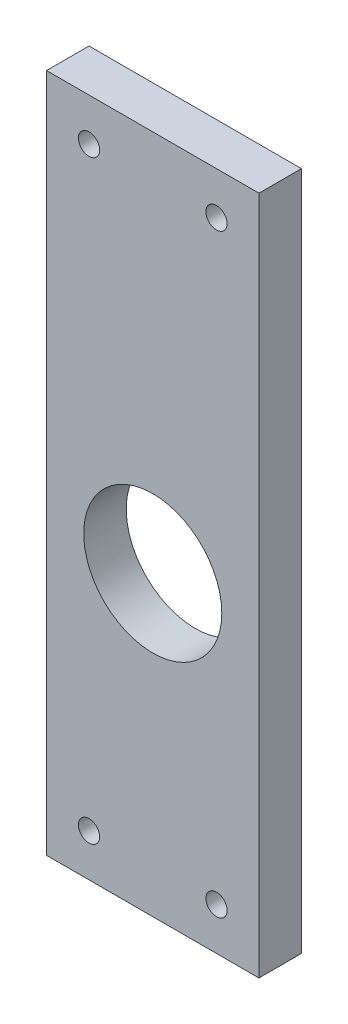
ISO-10303-21;
HEADER;
FILE_DESCRIPTION(('STEP AP214'),'2;1');
FILE_NAME('part.step','',(''),(''),'','','');
FILE_SCHEMA(('AUTOMOTIVE_DESIGN { 1 0 10303 214 1 1 1 1 }'));
ENDSEC;
DATA;
#1=APPLICATION_CONTEXT('core data for automotive mechanical design processes');
#2=APPLICATION_PROTOCOL_DEFINITION('international standard','automotive_design',2000,#1);
#3=PRODUCT_CONTEXT('',#1,'mechanical');
#4=PRODUCT('Part','Part','',(#3));
#5=PRODUCT_RELATED_PRODUCT_CATEGORY('part','',(#4));
#6=PRODUCT_DEFINITION_FORMATION('','',#4);
#7=PRODUCT_DEFINITION_CONTEXT('part definition',#1,'design');
#8=PRODUCT_DEFINITION('design','',#6,#7);
#9=PRODUCT_DEFINITION_SHAPE('','',#8);
#10=(LENGTH_UNIT() NAMED_UNIT(*) SI_UNIT(.MILLI.,.METRE.));
#11=(NAMED_UNIT(*) PLANE_ANGLE_UNIT() SI_UNIT($,.RADIAN.));
#12=(NAMED_UNIT(*) SI_UNIT($,.STERADIAN.) SOLID_ANGLE_UNIT());
#13=UNCERTAINTY_MEASURE_WITH_UNIT(LENGTH_MEASURE(1.E-05),#10,'distance_accuracy_value','');
#14=(GEOMETRIC_REPRESENTATION_CONTEXT(3) GLOBAL_UNCERTAINTY_ASSIGNED_CONTEXT((#13)) GLOBAL_UNIT_ASSIGNED_CONTEXT((#10,
#11,#12)) REPRESENTATION_CONTEXT('',''));
#15=CARTESIAN_POINT('',(0.,0.,0.));
#16=DIRECTION('',(0.,0.,1.));
#17=DIRECTION('',(1.,0.,0.));
#18=AXIS2_PLACEMENT_3D('',#15,#16,#17);
#19=CARTESIAN_POINT('',(19.05,-88.9,0.));
#20=DIRECTION('',(0.,0.,1.));
#21=DIRECTION('',(1.,0.,0.));
#22=AXIS2_PLACEMENT_3D('',#19,#20,#21);
#23=CYLINDRICAL_SURFACE('',#22,3.175);
#24=CARTESIAN_POINT('',(19.05,-88.9,0.));
#25=DIRECTION('',(0.,0.,1.));
#26=DIRECTION('',(1.,0.,0.));
#27=AXIS2_PLACEMENT_3D('',#24,#25,#26);
#28=CIRCLE('',#27,3.175);
#29=CARTESIAN_POINT('',(22.225,-88.9,0.));
#30=VERTEX_POINT('',#29);
#31=EDGE_CURVE('E42',#30,#30,#28,.T.);
#32=ORIENTED_EDGE('',*,*,#31,.F.);
#33=EDGE_LOOP('',(#32));
#34=FACE_BOUND('',#33,.T.);
#35=CARTESIAN_POINT('',(19.05,-88.9,12.7));
#36=DIRECTION('',(0.,0.,1.));
#37=DIRECTION('',(1.,0.,0.));
#38=AXIS2_PLACEMENT_3D('',#35,#36,#37);
#39=CIRCLE('',#38,3.175);
#40=CARTESIAN_POINT('',(22.225,-88.9,12.7));
#41=VERTEX_POINT('',#40);
#42=EDGE_CURVE('E11',#41,#41,#39,.T.);
#43=ORIENTED_EDGE('',*,*,#42,.T.);
#44=EDGE_LOOP('',(#43));
#45=FACE_BOUND('',#44,.T.);
#46=ADVANCED_FACE('F34',(#34,#45),#23,.F.);
#47=CARTESIAN_POINT('',(-19.05,-88.9,0.));
#48=DIRECTION('',(0.,0.,1.));
#49=DIRECTION('',(1.,0.,0.));
#50=AXIS2_PLACEMENT_3D('',#47,#48,#49);
#51=CYLINDRICAL_SURFACE('',#50,3.175);
#52=CARTESIAN_POINT('',(-19.05,-88.9,0.));
#53=DIRECTION('',(0.,0.,1.));
#54=DIRECTION('',(1.,0.,0.));
#55=AXIS2_PLACEMENT_3D('',#52,#53,#54);
#56=CIRCLE('',#55,3.175);
#57=CARTESIAN_POINT('',(-15.875,-88.9,0.));
#58=VERTEX_POINT('',#57);
#59=EDGE_CURVE('E112',#58,#58,#56,.T.);
#60=ORIENTED_EDGE('',*,*,#59,.F.);
#61=EDGE_LOOP('',(#60));
#62=FACE_BOUND('',#61,.T.);
#63=CARTESIAN_POINT('',(-19.05,-88.9,12.7));
#64=DIRECTION('',(0.,0.,1.));
#65=DIRECTION('',(1.,0.,0.));
#66=AXIS2_PLACEMENT_3D('',#63,#64,#65);
#67=CIRCLE('',#66,3.175);
#68=CARTESIAN_POINT('',(-15.875,-88.9,12.7));
#69=VERTEX_POINT('',#68);
#70=EDGE_CURVE('E115',#69,#69,#67,.T.);
#71=ORIENTED_EDGE('',*,*,#70,.T.);
#72=EDGE_LOOP('',(#71));
#73=FACE_BOUND('',#72,.T.);
#74=ADVANCED_FACE('F124',(#62,#73),#51,.F.);
#75=CARTESIAN_POINT('',(31.75,101.6,12.7));
#76=DIRECTION('',(-1.,0.,0.));
#77=DIRECTION('',(0.,-1.,0.));
#78=AXIS2_PLACEMENT_3D('',#75,#76,#77);
#79=PLANE('',#78);
#80=DIRECTION('',(0.,1.,0.));
#81=VECTOR('',#80,1.);
#82=CARTESIAN_POINT('',(31.75,101.6,0.));
#83=LINE('',#82,#81);
#84=CARTESIAN_POINT('',(31.75,-101.6,0.));
#85=VERTEX_POINT('',#84);
#86=CARTESIAN_POINT('',(31.75,101.6,0.));
#87=VERTEX_POINT('',#86);
#88=EDGE_CURVE('E102',#85,#87,#83,.T.);
#89=ORIENTED_EDGE('',*,*,#88,.T.);
#90=DIRECTION('',(0.,0.,-1.));
#91=VECTOR('',#90,1.);
#92=CARTESIAN_POINT('',(31.75,101.6,12.7));
#93=LINE('',#92,#91);
#94=CARTESIAN_POINT('',(31.75,101.6,12.7));
#95=VERTEX_POINT('',#94);
#96=EDGE_CURVE('E93',#95,#87,#93,.T.);
#97=ORIENTED_EDGE('',*,*,#96,.F.);
#98=DIRECTION('',(0.,1.,0.));
#99=VECTOR('',#98,1.);
#100=CARTESIAN_POINT('',(31.75,101.6,12.7));
#101=LINE('',#100,#99);
#102=CARTESIAN_POINT('',(31.75,-101.6,12.7));
#103=VERTEX_POINT('',#102);
#104=EDGE_CURVE('E87',#103,#95,#101,.T.);
#105=ORIENTED_EDGE('',*,*,#104,.F.);
#106=DIRECTION('',(0.,0.,-1.));
#107=VECTOR('',#106,1.);
#108=CARTESIAN_POINT('',(31.75,-101.6,12.7));
#109=LINE('',#108,#107);
#110=EDGE_CURVE('E98',#103,#85,#109,.T.);
#111=ORIENTED_EDGE('',*,*,#110,.T.);
#112=EDGE_LOOP('',(#89,#97,#105,#111));
#113=FACE_BOUND('',#112,.T.);
#114=ADVANCED_FACE('F148',(#113),#79,.F.);
#115=CARTESIAN_POINT('',(-31.75,101.6,12.7));
#116=DIRECTION('',(0.,-1.,0.));
#117=DIRECTION('',(0.,0.,-1.));
#118=AXIS2_PLACEMENT_3D('',#115,#116,#117);
#119=PLANE('',#118);
#120=DIRECTION('',(-1.,0.,0.));
#121=VECTOR('',#120,1.);
#122=CARTESIAN_POINT('',(-31.75,101.6,0.));
#123=LINE('',#122,#121);
#124=CARTESIAN_POINT('',(-31.75,101.6,0.));
#125=VERTEX_POINT('',#124);
#126=EDGE_CURVE('E92',#87,#125,#123,.T.);
#127=ORIENTED_EDGE('',*,*,#126,.T.);
#128=DIRECTION('',(0.,0.,-1.));
#129=VECTOR('',#128,1.);
#130=CARTESIAN_POINT('',(-31.75,101.6,12.7));
#131=LINE('',#130,#129);
#132=CARTESIAN_POINT('',(-31.75,101.6,12.7));
#133=VERTEX_POINT('',#132);
#134=EDGE_CURVE('E90',#133,#125,#131,.T.);
#135=ORIENTED_EDGE('',*,*,#134,.F.);
#136=DIRECTION('',(-1.,0.,0.));
#137=VECTOR('',#136,1.);
#138=CARTESIAN_POINT('',(-31.75,101.6,12.7));
#139=LINE('',#138,#137);
#140=EDGE_CURVE('E81',#95,#133,#139,.T.);
#141=ORIENTED_EDGE('',*,*,#140,.F.);
#142=ORIENTED_EDGE('',*,*,#96,.T.);
#143=EDGE_LOOP('',(#127,#135,#141,#142));
#144=FACE_BOUND('',#143,.T.);
#145=ADVANCED_FACE('F91',(#144),#119,.F.);
#146=CARTESIAN_POINT('',(-31.75,101.6,12.7));
#147=DIRECTION('',(1.,0.,0.));
#148=DIRECTION('',(0.,1.,0.));
#149=AXIS2_PLACEMENT_3D('',#146,#147,#148);
#150=PLANE('',#149);
#151=DIRECTION('',(0.,-1.,0.));
#152=VECTOR('',#151,1.);
#153=CARTESIAN_POINT('',(-31.75,101.6,0.));
#154=LINE('',#153,#152);
#155=CARTESIAN_POINT('',(-31.75,-101.6,0.));
#156=VERTEX_POINT('',#155);
#157=EDGE_CURVE('E67',#125,#156,#154,.T.);
#158=ORIENTED_EDGE('',*,*,#157,.T.);
#159=DIRECTION('',(0.,0.,-1.));
#160=VECTOR('',#159,1.);
#161=CARTESIAN_POINT('',(-31.75,-101.6,12.7));
#162=LINE('',#161,#160);
#163=CARTESIAN_POINT('',(-31.75,-101.6,12.7));
#164=VERTEX_POINT('',#163);
#165=EDGE_CURVE('E94',#164,#156,#162,.T.);
#166=ORIENTED_EDGE('',*,*,#165,.F.);
#167=DIRECTION('',(0.,-1.,0.));
#168=VECTOR('',#167,1.);
#169=CARTESIAN_POINT('',(-31.75,101.6,12.7));
#170=LINE('',#169,#168);
#171=EDGE_CURVE('E85',#133,#164,#170,.T.);
#172=ORIENTED_EDGE('',*,*,#171,.F.);
#173=ORIENTED_EDGE('',*,*,#134,.T.);
#174=EDGE_LOOP('',(#158,#166,#172,#173));
#175=FACE_BOUND('',#174,.T.);
#176=ADVANCED_FACE('F96',(#175),#150,.F.);
#177=CARTESIAN_POINT('',(-31.75,-101.6,12.7));
#178=DIRECTION('',(0.,1.,0.));
#179=DIRECTION('',(0.,0.,1.));
#180=AXIS2_PLACEMENT_3D('',#177,#178,#179);
#181=PLANE('',#180);
#182=DIRECTION('',(1.,0.,0.));
#183=VECTOR('',#182,1.);
#184=CARTESIAN_POINT('',(-31.75,-101.6,0.));
#185=LINE('',#184,#183);
#186=EDGE_CURVE('E73',#156,#85,#185,.T.);
#187=ORIENTED_EDGE('',*,*,#186,.T.);
#188=ORIENTED_EDGE('',*,*,#110,.F.);
#189=DIRECTION('',(1.,0.,0.));
#190=VECTOR('',#189,1.);
#191=CARTESIAN_POINT('',(-31.75,-101.6,12.7));
#192=LINE('',#191,#190);
#193=EDGE_CURVE('E50',#164,#103,#192,.T.);
#194=ORIENTED_EDGE('',*,*,#193,.F.);
#195=ORIENTED_EDGE('',*,*,#165,.T.);
#196=EDGE_LOOP('',(#187,#188,#194,#195));
#197=FACE_BOUND('',#196,.T.);
#198=ADVANCED_FACE('F128',(#197),#181,.F.);
#199=CARTESIAN_POINT('',(0.,0.,12.7));
#200=DIRECTION('',(0.,0.,1.));
#201=DIRECTION('',(1.,0.,0.));
#202=AXIS2_PLACEMENT_3D('',#199,#200,#201);
#203=PLANE('',#202);
#204=CARTESIAN_POINT('',(0.,-12.7,12.7));
#205=DIRECTION('',(0.,0.,1.));
#206=DIRECTION('',(1.,0.,0.));
#207=AXIS2_PLACEMENT_3D('',#204,#205,#206);
#208=CIRCLE('',#207,20.6375);
#209=CARTESIAN_POINT('',(20.6375,-12.7,12.7));
#210=VERTEX_POINT('',#209);
#211=EDGE_CURVE('E229',#210,#210,#208,.T.);
#212=ORIENTED_EDGE('',*,*,#211,.F.);
#213=EDGE_LOOP('',(#212));
#214=FACE_BOUND('',#213,.T.);
#215=CARTESIAN_POINT('',(19.05,88.9,12.7));
#216=DIRECTION('',(0.,0.,1.));
#217=DIRECTION('',(1.,0.,0.));
#218=AXIS2_PLACEMENT_3D('',#215,#216,#217);
#219=CIRCLE('',#218,3.175);
#220=CARTESIAN_POINT('',(22.225,88.9,12.7));
#221=VERTEX_POINT('',#220);
#222=EDGE_CURVE('E236',#221,#221,#219,.T.);
#223=ORIENTED_EDGE('',*,*,#222,.F.);
#224=EDGE_LOOP('',(#223));
#225=FACE_BOUND('',#224,.T.);
#226=CARTESIAN_POINT('',(-19.05,88.9,12.7));
#227=DIRECTION('',(0.,0.,1.));
#228=DIRECTION('',(1.,0.,0.));
#229=AXIS2_PLACEMENT_3D('',#226,#227,#228);
#230=CIRCLE('',#229,3.175);
#231=CARTESIAN_POINT('',(-15.875,88.9,12.7));
#232=VERTEX_POINT('',#231);
#233=EDGE_CURVE('E239',#232,#232,#230,.T.);
#234=ORIENTED_EDGE('',*,*,#233,.F.);
#235=EDGE_LOOP('',(#234));
#236=FACE_BOUND('',#235,.T.);
#237=ORIENTED_EDGE('',*,*,#104,.T.);
#238=ORIENTED_EDGE('',*,*,#140,.T.);
#239=ORIENTED_EDGE('',*,*,#171,.T.);
#240=ORIENTED_EDGE('',*,*,#193,.T.);
#241=EDGE_LOOP('',(#237,#238,#239,#240));
#242=FACE_BOUND('',#241,.T.);
#243=ORIENTED_EDGE('',*,*,#70,.F.);
#244=EDGE_LOOP('',(#243));
#245=FACE_BOUND('',#244,.T.);
#246=ORIENTED_EDGE('',*,*,#42,.F.);
#247=EDGE_LOOP('',(#246));
#248=FACE_BOUND('',#247,.T.);
#249=ADVANCED_FACE('F82',(#214,#225,#236,#242,#245,#248),#203,.T.);
#250=CARTESIAN_POINT('',(0.,0.,0.));
#251=DIRECTION('',(0.,0.,1.));
#252=DIRECTION('',(1.,0.,0.));
#253=AXIS2_PLACEMENT_3D('',#250,#251,#252);
#254=PLANE('',#253);
#255=CARTESIAN_POINT('',(0.,-12.7,0.));
#256=DIRECTION('',(0.,0.,1.));
#257=DIRECTION('',(1.,0.,0.));
#258=AXIS2_PLACEMENT_3D('',#255,#256,#257);
#259=CIRCLE('',#258,20.6375);
#260=CARTESIAN_POINT('',(20.6375,-12.7,0.));
#261=VERTEX_POINT('',#260);
#262=EDGE_CURVE('E227',#261,#261,#259,.T.);
#263=ORIENTED_EDGE('',*,*,#262,.T.);
#264=EDGE_LOOP('',(#263));
#265=FACE_BOUND('',#264,.T.);
#266=CARTESIAN_POINT('',(19.05,88.9,0.));
#267=DIRECTION('',(0.,0.,1.));
#268=DIRECTION('',(1.,0.,0.));
#269=AXIS2_PLACEMENT_3D('',#266,#267,#268);
#270=CIRCLE('',#269,3.175);
#271=CARTESIAN_POINT('',(22.225,88.9,0.));
#272=VERTEX_POINT('',#271);
#273=EDGE_CURVE('E231',#272,#272,#270,.T.);
#274=ORIENTED_EDGE('',*,*,#273,.T.);
#275=EDGE_LOOP('',(#274));
#276=FACE_BOUND('',#275,.T.);
#277=CARTESIAN_POINT('',(-19.05,88.9,0.));
#278=DIRECTION('',(0.,0.,1.));
#279=DIRECTION('',(1.,0.,0.));
#280=AXIS2_PLACEMENT_3D('',#277,#278,#279);
#281=CIRCLE('',#280,3.175);
#282=CARTESIAN_POINT('',(-15.875,88.9,0.));
#283=VERTEX_POINT('',#282);
#284=EDGE_CURVE('E105',#283,#283,#281,.T.);
#285=ORIENTED_EDGE('',*,*,#284,.T.);
#286=EDGE_LOOP('',(#285));
#287=FACE_BOUND('',#286,.T.);
#288=ORIENTED_EDGE('',*,*,#88,.F.);
#289=ORIENTED_EDGE('',*,*,#186,.F.);
#290=ORIENTED_EDGE('',*,*,#157,.F.);
#291=ORIENTED_EDGE('',*,*,#126,.F.);
#292=EDGE_LOOP('',(#288,#289,#290,#291));
#293=FACE_BOUND('',#292,.T.);
#294=ORIENTED_EDGE('',*,*,#59,.T.);
#295=EDGE_LOOP('',(#294));
#296=FACE_BOUND('',#295,.T.);
#297=ORIENTED_EDGE('',*,*,#31,.T.);
#298=EDGE_LOOP('',(#297));
#299=FACE_BOUND('',#298,.T.);
#300=ADVANCED_FACE('F120',(#265,#276,#287,#293,#296,#299),#254,.F.);
#301=CARTESIAN_POINT('',(-19.05,88.9,0.));
#302=DIRECTION('',(0.,0.,1.));
#303=DIRECTION('',(1.,0.,0.));
#304=AXIS2_PLACEMENT_3D('',#301,#302,#303);
#305=CYLINDRICAL_SURFACE('',#304,3.175);
#306=ORIENTED_EDGE('',*,*,#284,.F.);
#307=EDGE_LOOP('',(#306));
#308=FACE_BOUND('',#307,.T.);
#309=ORIENTED_EDGE('',*,*,#233,.T.);
#310=EDGE_LOOP('',(#309));
#311=FACE_BOUND('',#310,.T.);
#312=ADVANCED_FACE('F135',(#308,#311),#305,.F.);
#313=CARTESIAN_POINT('',(19.05,88.9,0.));
#314=DIRECTION('',(0.,0.,1.));
#315=DIRECTION('',(1.,0.,0.));
#316=AXIS2_PLACEMENT_3D('',#313,#314,#315);
#317=CYLINDRICAL_SURFACE('',#316,3.175);
#318=ORIENTED_EDGE('',*,*,#273,.F.);
#319=EDGE_LOOP('',(#318));
#320=FACE_BOUND('',#319,.T.);
#321=ORIENTED_EDGE('',*,*,#222,.T.);
#322=EDGE_LOOP('',(#321));
#323=FACE_BOUND('',#322,.T.);
#324=ADVANCED_FACE('F187',(#320,#323),#317,.F.);
#325=CARTESIAN_POINT('',(0.,-12.7,0.));
#326=DIRECTION('',(0.,0.,1.));
#327=DIRECTION('',(1.,0.,0.));
#328=AXIS2_PLACEMENT_3D('',#325,#326,#327);
#329=CYLINDRICAL_SURFACE('',#328,20.6375);
#330=ORIENTED_EDGE('',*,*,#262,.F.);
#331=EDGE_LOOP('',(#330));
#332=FACE_BOUND('',#331,.T.);
#333=ORIENTED_EDGE('',*,*,#211,.T.);
#334=EDGE_LOOP('',(#333));
#335=FACE_BOUND('',#334,.T.);
#336=ADVANCED_FACE('F204',(#332,#335),#329,.F.);
#337=CLOSED_SHELL('',(#46,#74,#114,#145,#176,#198,#249,#300,#312,#324,#336));
#338=MANIFOLD_SOLID_BREP('B2',#337);
#339=ADVANCED_BREP_SHAPE_REPRESENTATION('',(#18,#338),#14);
#340=SHAPE_DEFINITION_REPRESENTATION(#9,#339);
ENDSEC;
END-ISO-10303-21;
